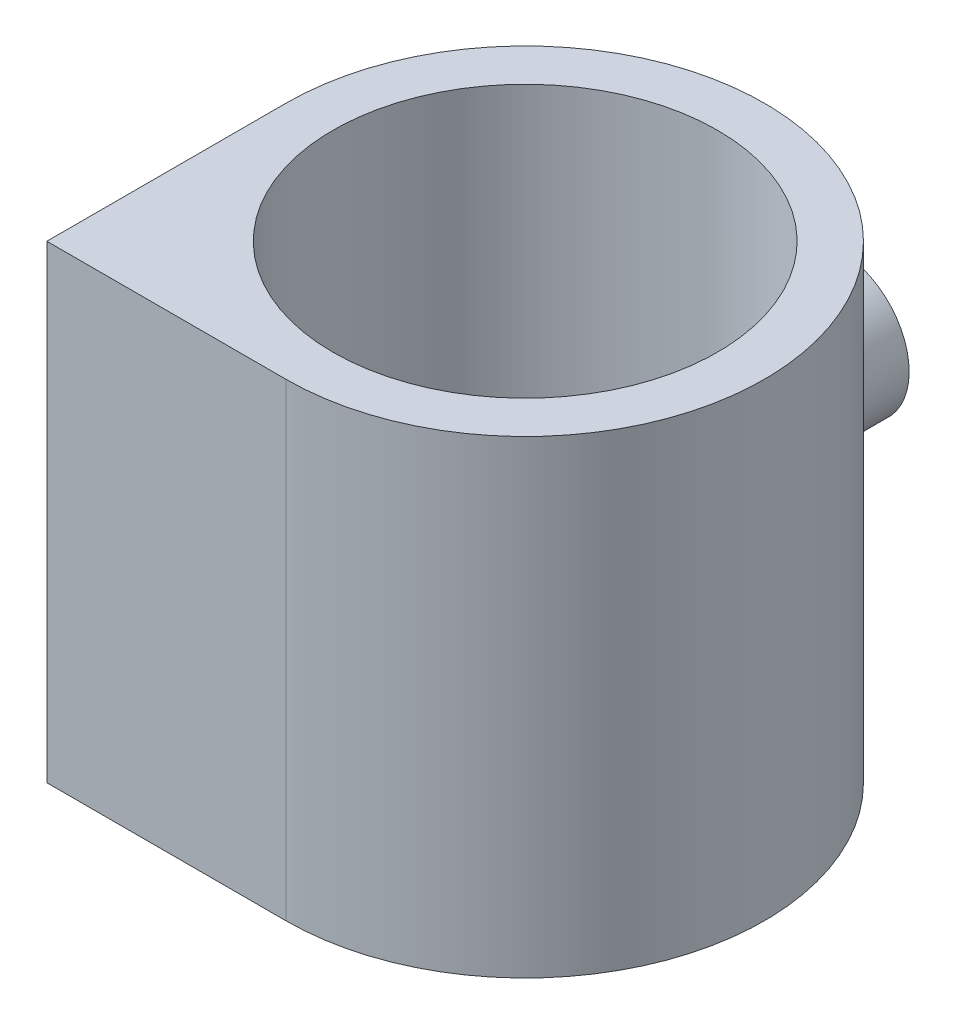
ISO-10303-21;
HEADER;
FILE_DESCRIPTION(('STEP AP214'),'2;1');
FILE_NAME('part.step','',(''),(''),'','','');
FILE_SCHEMA(('AUTOMOTIVE_DESIGN { 1 0 10303 214 1 1 1 1 }'));
ENDSEC;
DATA;
#1=APPLICATION_CONTEXT('core data for automotive mechanical design processes');
#2=APPLICATION_PROTOCOL_DEFINITION('international standard','automotive_design',2000,#1);
#3=PRODUCT_CONTEXT('',#1,'mechanical');
#4=PRODUCT('Part','Part','',(#3));
#5=PRODUCT_RELATED_PRODUCT_CATEGORY('part','',(#4));
#6=PRODUCT_DEFINITION_FORMATION('','',#4);
#7=PRODUCT_DEFINITION_CONTEXT('part definition',#1,'design');
#8=PRODUCT_DEFINITION('design','',#6,#7);
#9=PRODUCT_DEFINITION_SHAPE('','',#8);
#10=(LENGTH_UNIT() NAMED_UNIT(*) SI_UNIT(.MILLI.,.METRE.));
#11=(NAMED_UNIT(*) PLANE_ANGLE_UNIT() SI_UNIT($,.RADIAN.));
#12=(NAMED_UNIT(*) SI_UNIT($,.STERADIAN.) SOLID_ANGLE_UNIT());
#13=UNCERTAINTY_MEASURE_WITH_UNIT(LENGTH_MEASURE(1.E-05),#10,'distance_accuracy_value','');
#14=(GEOMETRIC_REPRESENTATION_CONTEXT(3) GLOBAL_UNCERTAINTY_ASSIGNED_CONTEXT((#13)) GLOBAL_UNIT_ASSIGNED_CONTEXT((#10,
#11,#12)) REPRESENTATION_CONTEXT('',''));
#15=CARTESIAN_POINT('',(0.,0.,0.));
#16=DIRECTION('',(0.,0.,1.));
#17=DIRECTION('',(1.,0.,0.));
#18=AXIS2_PLACEMENT_3D('',#15,#16,#17);
#19=CARTESIAN_POINT('',(103.,25.,-48.));
#20=DIRECTION('',(0.,0.,-1.));
#21=DIRECTION('',(-1.,0.,0.));
#22=AXIS2_PLACEMENT_3D('',#19,#20,#21);
#23=CONICAL_SURFACE('',#22,2.,0.785398163397451);
#24=CARTESIAN_POINT('',(103.,25.,-52.));
#25=DIRECTION('',(0.,0.,1.));
#26=DIRECTION('',(1.,0.,0.));
#27=AXIS2_PLACEMENT_3D('',#24,#25,#26);
#28=CIRCLE('',#27,6.00000000000006);
#29=CARTESIAN_POINT('',(96.9999999999999,25.,-52.));
#30=VERTEX_POINT('',#29);
#31=EDGE_CURVE('E49',#30,#30,#28,.T.);
#32=CARTESIAN_POINT('',(103.,25.,-48.));
#33=DIRECTION('',(0.,0.,1.));
#34=DIRECTION('',(1.,0.,0.));
#35=AXIS2_PLACEMENT_3D('',#32,#33,#34);
#36=CIRCLE('',#35,2.);
#37=CARTESIAN_POINT('',(101.,25.,-48.));
#38=VERTEX_POINT('',#37);
#39=EDGE_CURVE('E199',#38,#38,#36,.F.);
#40=CARTESIAN_POINT('',(96.9999999999999,25.,-52.));
#41=CARTESIAN_POINT('',(97.0416666666666,25.,-51.9583333333333));
#42=CARTESIAN_POINT('',(97.0833333333333,25.,-51.9166666666667));
#43=CARTESIAN_POINT('',(97.1666666666666,25.,-51.8333333333333));
#44=CARTESIAN_POINT('',(97.2083333333333,25.,-51.7916666666667));
#45=CARTESIAN_POINT('',(97.2916666666666,25.,-51.7083333333333));
#46=CARTESIAN_POINT('',(97.3333333333333,25.,-51.6666666666667));
#47=CARTESIAN_POINT('',(97.4166666666666,25.,-51.5833333333333));
#48=CARTESIAN_POINT('',(97.4583333333333,25.,-51.5416666666667));
#49=CARTESIAN_POINT('',(97.5416666666666,25.,-51.4583333333333));
#50=CARTESIAN_POINT('',(97.5833333333333,25.,-51.4166666666667));
#51=CARTESIAN_POINT('',(97.6666666666666,25.,-51.3333333333333));
#52=CARTESIAN_POINT('',(97.7083333333333,25.,-51.2916666666667));
#53=CARTESIAN_POINT('',(97.7916666666666,25.,-51.2083333333333));
#54=CARTESIAN_POINT('',(97.8333333333333,25.,-51.1666666666667));
#55=CARTESIAN_POINT('',(97.9166666666666,25.,-51.0833333333333));
#56=CARTESIAN_POINT('',(97.9583333333333,25.,-51.0416666666667));
#57=CARTESIAN_POINT('',(98.0416666666666,25.,-50.9583333333333));
#58=CARTESIAN_POINT('',(98.0833333333333,25.,-50.9166666666667));
#59=CARTESIAN_POINT('',(98.1666666666666,25.,-50.8333333333333));
#60=CARTESIAN_POINT('',(98.2083333333333,25.,-50.7916666666667));
#61=CARTESIAN_POINT('',(98.2916666666666,25.,-50.7083333333333));
#62=CARTESIAN_POINT('',(98.3333333333333,25.,-50.6666666666667));
#63=CARTESIAN_POINT('',(98.4166666666666,25.,-50.5833333333333));
#64=CARTESIAN_POINT('',(98.4583333333333,25.,-50.5416666666667));
#65=CARTESIAN_POINT('',(98.5416666666666,25.,-50.4583333333333));
#66=CARTESIAN_POINT('',(98.5833333333333,25.,-50.4166666666667));
#67=CARTESIAN_POINT('',(98.6666666666666,25.,-50.3333333333333));
#68=CARTESIAN_POINT('',(98.7083333333333,25.,-50.2916666666667));
#69=CARTESIAN_POINT('',(98.7916666666666,25.,-50.2083333333333));
#70=CARTESIAN_POINT('',(98.8333333333333,25.,-50.1666666666667));
#71=CARTESIAN_POINT('',(98.9166666666666,25.,-50.0833333333333));
#72=CARTESIAN_POINT('',(98.9583333333333,25.,-50.0416666666667));
#73=CARTESIAN_POINT('',(99.0416666666666,25.,-49.9583333333333));
#74=CARTESIAN_POINT('',(99.0833333333333,25.,-49.9166666666667));
#75=CARTESIAN_POINT('',(99.1666666666666,25.,-49.8333333333333));
#76=CARTESIAN_POINT('',(99.2083333333333,25.,-49.7916666666667));
#77=CARTESIAN_POINT('',(99.2916666666666,25.,-49.7083333333333));
#78=CARTESIAN_POINT('',(99.3333333333333,25.,-49.6666666666667));
#79=CARTESIAN_POINT('',(99.4166666666666,25.,-49.5833333333333));
#80=CARTESIAN_POINT('',(99.4583333333333,25.,-49.5416666666666));
#81=CARTESIAN_POINT('',(99.5416666666667,25.,-49.4583333333333));
#82=CARTESIAN_POINT('',(99.5833333333333,25.,-49.4166666666667));
#83=CARTESIAN_POINT('',(99.6666666666667,25.,-49.3333333333333));
#84=CARTESIAN_POINT('',(99.7083333333333,25.,-49.2916666666666));
#85=CARTESIAN_POINT('',(99.7916666666667,25.,-49.2083333333333));
#86=CARTESIAN_POINT('',(99.8333333333333,25.,-49.1666666666666));
#87=CARTESIAN_POINT('',(99.9166666666667,25.,-49.0833333333333));
#88=CARTESIAN_POINT('',(99.9583333333333,25.,-49.0416666666666));
#89=CARTESIAN_POINT('',(100.041666666667,25.,-48.9583333333333));
#90=CARTESIAN_POINT('',(100.083333333333,25.,-48.9166666666666));
#91=CARTESIAN_POINT('',(100.166666666667,25.,-48.8333333333333));
#92=CARTESIAN_POINT('',(100.208333333333,25.,-48.7916666666666));
#93=CARTESIAN_POINT('',(100.291666666667,25.,-48.7083333333333));
#94=CARTESIAN_POINT('',(100.333333333333,25.,-48.6666666666666));
#95=CARTESIAN_POINT('',(100.416666666667,25.,-48.5833333333333));
#96=CARTESIAN_POINT('',(100.458333333333,25.,-48.5416666666666));
#97=CARTESIAN_POINT('',(100.541666666667,25.,-48.4583333333333));
#98=CARTESIAN_POINT('',(100.583333333333,25.,-48.4166666666666));
#99=CARTESIAN_POINT('',(100.666666666667,25.,-48.3333333333333));
#100=CARTESIAN_POINT('',(100.708333333333,25.,-48.2916666666666));
#101=CARTESIAN_POINT('',(100.791666666667,25.,-48.2083333333333));
#102=CARTESIAN_POINT('',(100.833333333333,25.,-48.1666666666666));
#103=CARTESIAN_POINT('',(100.916666666667,25.,-48.0833333333333));
#104=CARTESIAN_POINT('',(100.958333333333,25.,-48.0416666666666));
#105=CARTESIAN_POINT('',(101.,25.,-48.));
#106=B_SPLINE_CURVE_WITH_KNOTS('',3,(#40,#41,#42,#43,#44,#45,#46,#47,#48,#49,#50,#51,#52,#53,
#54,#55,#56,#57,#58,#59,#60,#61,#62,#63,#64,#65,#66,#67,#68,#69,#70,#71,#72,#73,#74,#75,#76,#77,
#78,#79,#80,#81,#82,#83,#84,#85,#86,#87,#88,#89,#90,#91,#92,#93,#94,#95,#96,#97,#98,#99,#100,
#101,#102,#103,#104,#105),.UNSPECIFIED.,.F.,.F.,(4,2,2,2,2,2,2,2,2,2,2,2,2,2,2,2,2,2,2,2,2,2,2,
2,2,2,2,2,2,2,2,2,4),(0.,0.176776695296637,0.353553390593274,0.530330085889911,
0.707106781186548,0.883883476483195,1.06066017177984,1.23743686707647,1.41421356237311,
1.59099025766975,1.76776695296639,1.94454364826303,2.12132034355966,2.2980970388563,
2.47487373415295,2.65165042944959,2.82842712474622,3.00520382004286,3.1819805153395,
3.35875721063614,3.53553390593278,3.71231060122942,3.88908729652606,4.0658639918227,
4.24264068711934,4.41941738241598,4.59619407771261,4.77297077300926,4.9497474683059,
5.12652416360254,5.30330085889918,5.48007755419581,5.65685424949246),.UNSPECIFIED.);
#107=EDGE_CURVE('BSEAM41',#30,#38,#106,.T.);
#108=ORIENTED_EDGE('',*,*,#31,.F.);
#109=ORIENTED_EDGE('',*,*,#39,.F.);
#110=ORIENTED_EDGE('',*,*,#107,.T.);
#111=ORIENTED_EDGE('',*,*,#107,.F.);
#112=EDGE_LOOP('',(#108,#110,#109,#111));
#113=FACE_BOUND('',#112,.T.);
#114=ADVANCED_FACE('F41',(#113),#23,.F.);
#115=CARTESIAN_POINT('',(103.,25.,-52.));
#116=DIRECTION('',(0.,0.,1.));
#117=DIRECTION('',(1.,0.,0.));
#118=AXIS2_PLACEMENT_3D('',#115,#116,#117);
#119=PLANE('',#118);
#120=ORIENTED_EDGE('',*,*,#31,.T.);
#121=EDGE_LOOP('',(#120));
#122=FACE_BOUND('',#121,.T.);
#123=CARTESIAN_POINT('',(103.,25.,-52.));
#124=DIRECTION('',(0.,0.,1.));
#125=DIRECTION('',(1.,0.,0.));
#126=AXIS2_PLACEMENT_3D('',#123,#124,#125);
#127=CIRCLE('',#126,7.50000000000001);
#128=CARTESIAN_POINT('',(110.5,25.,-52.));
#129=VERTEX_POINT('',#128);
#130=EDGE_CURVE('E146',#129,#129,#127,.T.);
#131=ORIENTED_EDGE('',*,*,#130,.F.);
#132=EDGE_LOOP('',(#131));
#133=FACE_BOUND('',#132,.T.);
#134=ADVANCED_FACE('F206',(#122,#133),#119,.F.);
#135=CARTESIAN_POINT('',(103.,25.,6.93351096398718));
#136=DIRECTION('',(0.,0.,-1.));
#137=DIRECTION('',(-1.,0.,0.));
#138=AXIS2_PLACEMENT_3D('',#135,#136,#137);
#139=CYLINDRICAL_SURFACE('',#138,2.);
#140=ORIENTED_EDGE('',*,*,#39,.T.);
#141=EDGE_LOOP('',(#140));
#142=FACE_BOUND('',#141,.T.);
#143=CARTESIAN_POINT('',(101.,25.,-38.969694799116));
#144=CARTESIAN_POINT('',(101.00000486068,24.8879463126101,-38.9696960830209));
#145=CARTESIAN_POINT('',(101.009448731837,24.7758181889857,-38.9706278838935));
#146=CARTESIAN_POINT('',(101.04698009202,24.554669732685,-38.9742539673729));
#147=CARTESIAN_POINT('',(101.075088218365,24.4456529796158,-38.9769502008886));
#148=CARTESIAN_POINT('',(101.149122700976,24.2339619141491,-38.9837969003662));
#149=CARTESIAN_POINT('',(101.19503836553,24.1312838387844,-38.9879464935808));
#150=CARTESIAN_POINT('',(101.303364245341,23.935114412159,-38.9972312809159));
#151=CARTESIAN_POINT('',(101.365771145231,23.8416212195625,-39.002366276876));
#152=CARTESIAN_POINT('',(101.505540672371,23.6661287183812,-39.0130632385346));
#153=CARTESIAN_POINT('',(101.582948807655,23.5841657280325,-39.0186264715752));
#154=CARTESIAN_POINT('',(101.750426356388,23.4343728879621,-39.0295415517807));
#155=CARTESIAN_POINT('',(101.840496344652,23.3665436802241,-39.0348933893348));
#156=CARTESIAN_POINT('',(102.030962508133,23.2468189562056,-39.0447951171912));
#157=CARTESIAN_POINT('',(102.131378915973,23.1949554819303,-39.0493433871046));
#158=CARTESIAN_POINT('',(102.339546893281,23.1088394210507,-39.0571117405789));
#159=CARTESIAN_POINT('',(102.44729829185,23.0745864242963,-39.0603318550723));
#160=CARTESIAN_POINT('',(102.666711381263,23.0247698761163,-39.0650721881992));
#161=CARTESIAN_POINT('',(102.778359438483,23.009146799705,-39.0665978198452));
#162=CARTESIAN_POINT('',(103.002702670744,22.9968494196242,-39.0677956894787));
#163=CARTESIAN_POINT('',(103.115397819775,23.0001746465196,-39.067467973382));
#164=CARTESIAN_POINT('',(103.338232223104,23.0256311048035,-39.0650005083904));
#165=CARTESIAN_POINT('',(103.44837886745,23.0476983282686,-39.0628669269964));
#166=CARTESIAN_POINT('',(103.663397586473,23.1099126861504,-39.0570346306012));
#167=CARTESIAN_POINT('',(103.768269595454,23.1500600456885,-39.053335896112));
#168=CARTESIAN_POINT('',(103.969964175095,23.2473654033862,-39.0447785722716));
#169=CARTESIAN_POINT('',(104.066772969643,23.3045517798621,-39.0399180506676));
#170=CARTESIAN_POINT('',(104.249442746439,23.4342912541794,-39.0295826735495));
#171=CARTESIAN_POINT('',(104.33530342308,23.5068447808308,-39.0241078008943));
#172=CARTESIAN_POINT('',(104.494014493984,23.6656191295208,-39.0131313376707));
#173=CARTESIAN_POINT('',(104.566809205339,23.7518956226063,-39.0076297308037));
#174=CARTESIAN_POINT('',(104.696891018323,23.9354736567487,-38.9972426506239));
#175=CARTESIAN_POINT('',(104.754178099195,24.0327752125622,-38.9923571781357));
#176=CARTESIAN_POINT('',(104.851617920931,24.2356835486739,-38.9837549999125));
#177=CARTESIAN_POINT('',(104.891767308573,24.3412919495361,-38.9800385229447));
#178=CARTESIAN_POINT('',(104.953748432228,24.5577953893963,-38.9741998156193));
#179=CARTESIAN_POINT('',(104.975580698868,24.6686902751524,-38.9720775390797));
#180=CARTESIAN_POINT('',(105.000236394172,24.8921301994678,-38.9696754412969));
#181=CARTESIAN_POINT('',(105.003137683818,25.0046665685735,-38.9693880733851));
#182=CARTESIAN_POINT('',(104.990053465342,25.2286239076105,-38.9706684138276));
#183=CARTESIAN_POINT('',(104.974068199906,25.3400448918557,-38.9722360983447));
#184=CARTESIAN_POINT('',(104.923729740185,25.5583822147988,-38.9770430365472));
#185=CARTESIAN_POINT('',(104.889413286026,25.665307103962,-38.9802789462554));
#186=CARTESIAN_POINT('',(104.80342405039,25.871882671832,-38.9880550057656));
#187=CARTESIAN_POINT('',(104.751750889941,25.9715331916498,-38.9925951840453));
#188=CARTESIAN_POINT('',(104.632319693495,26.1610864223773,-39.0024864883886));
#189=CARTESIAN_POINT('',(104.564510016681,26.250956459243,-39.0078401976494));
#190=CARTESIAN_POINT('',(104.414804761259,26.4180664807062,-39.0187468359001));
#191=CARTESIAN_POINT('',(104.332908850744,26.4953061676163,-39.0242997695817));
#192=CARTESIAN_POINT('',(104.157018280982,26.635231010319,-39.0350019116049));
#193=CARTESIAN_POINT('',(104.062983139984,26.6978654052467,-39.040149671886));
#194=CARTESIAN_POINT('',(103.865683651097,26.8064525610623,-39.0494404043272));
#195=CARTESIAN_POINT('',(103.762419424376,26.8524055409204,-39.0535833896762));
#196=CARTESIAN_POINT('',(103.549770988104,26.9262392372338,-39.0603912096784));
#197=CARTESIAN_POINT('',(103.440397547418,26.9541507276984,-39.0630585602478));
#198=CARTESIAN_POINT('',(103.218489316174,26.9912095981814,-39.0666248784702));
#199=CARTESIAN_POINT('',(103.105954609964,27.0003574783583,-39.0675238932595));
#200=CARTESIAN_POINT('',(102.881417162161,26.9996226143531,-39.0674522365196));
#201=CARTESIAN_POINT('',(102.769414151675,26.9898187194281,-39.0664893116247));
#202=CARTESIAN_POINT('',(102.548654129323,26.9516237995767,-39.0628172599771));
#203=CARTESIAN_POINT('',(102.439897120334,26.9232327581739,-39.0601081316764));
#204=CARTESIAN_POINT('',(102.228716041813,26.8486910332154,-39.0532472762779));
#205=CARTESIAN_POINT('',(102.126291199769,26.8025425210159,-39.0490957255633));
#206=CARTESIAN_POINT('',(101.930629094193,26.6938043233318,-39.0398130645471));
#207=CARTESIAN_POINT('',(101.837391762613,26.6312147596335,-39.0346819615016));
#208=CARTESIAN_POINT('',(101.662347292486,26.49107533097,-39.0239896808848));
#209=CARTESIAN_POINT('',(101.580587227951,26.4134667907983,-39.0184268695411));
#210=CARTESIAN_POINT('',(101.431214872223,26.2456069786476,-39.0075119801462));
#211=CARTESIAN_POINT('',(101.363605985536,26.1553526730353,-39.0021599530565));
#212=CARTESIAN_POINT('',(101.244326612567,25.9645244081393,-38.9922586293314));
#213=CARTESIAN_POINT('',(101.192695345825,25.863925850373,-38.9877113195195));
#214=CARTESIAN_POINT('',(101.107125984209,25.6555075497295,-38.9799580411686));
#215=CARTESIAN_POINT('',(101.073167871717,25.5476961335,-38.9767505558848));
#216=CARTESIAN_POINT('',(101.032405437446,25.3660584612102,-38.972851505412));
#217=CARTESIAN_POINT('',(101.020269934122,25.2933945943964,-38.9716733138807));
#218=CARTESIAN_POINT('',(101.004065635032,25.1471645200266,-38.9700945406238));
#219=CARTESIAN_POINT('',(100.999996807442,25.0735983160314,-38.9696939558306));
#220=CARTESIAN_POINT('',(101.,25.,-38.969694799116));
#221=B_SPLINE_CURVE_WITH_KNOTS('',3,(#143,#144,#145,#146,#147,#148,#149,#150,#151,#152,#153,
#154,#155,#156,#157,#158,#159,#160,#161,#162,#163,#164,#165,#166,#167,#168,#169,#170,#171,#172,
#173,#174,#175,#176,#177,#178,#179,#180,#181,#182,#183,#184,#185,#186,#187,#188,#189,#190,#191,
#192,#193,#194,#195,#196,#197,#198,#199,#200,#201,#202,#203,#204,#205,#206,#207,#208,#209,#210,
#211,#212,#213,#214,#215,#216,#217,#218,#219,#220),.UNSPECIFIED.,.T.,.F.,(4,2,2,2,2,2,2,2,2,2,2,
2,2,2,2,2,2,2,2,2,2,2,2,2,2,2,2,2,2,2,2,2,2,2,2,2,2,2,4),(0.,0.335892301541997,
0.672156623548028,1.00821936296056,1.3442145922482,1.68124552639673,2.01829176580891,
2.35601008651017,2.69372054135775,3.03034905179675,3.36696922246428,3.7024443648623,
4.03792368448423,4.37396489489533,4.71001548354643,5.04746586089092,5.38491668990609,
5.72243351552498,6.05994056333077,6.39605860283304,6.73217232334475,7.06761490457077,
7.40306481044742,7.73960302799373,8.07614917633362,8.41384811852923,8.75154262772707,
9.08865958864432,9.42576756333367,9.76147601144196,10.0971847571353,10.4328524659161,
10.7685176883216,11.1055217515753,11.4426067986747,11.7805128274546,12.1180352871242,
12.3386545801012,12.5592730027274),.UNSPECIFIED.);
#222=CARTESIAN_POINT('',(101.,25.,-38.969694799116));
#223=VERTEX_POINT('',#222);
#224=EDGE_CURVE('E135',#223,#223,#221,.T.);
#225=ORIENTED_EDGE('',*,*,#224,.T.);
#226=EDGE_LOOP('',(#225));
#227=FACE_BOUND('',#226,.T.);
#228=ADVANCED_FACE('F148',(#142,#227),#139,.F.);
#229=CARTESIAN_POINT('',(103.,25.,-52.));
#230=DIRECTION('',(0.,0.,1.));
#231=DIRECTION('',(1.,0.,0.));
#232=AXIS2_PLACEMENT_3D('',#229,#230,#231);
#233=CYLINDRICAL_SURFACE('',#232,7.50000000000001);
#234=CARTESIAN_POINT('',(103.,32.5,-44.0674890360128));
#235=CARTESIAN_POINT('',(103.205915668017,32.4999995296236,-44.0674887380694));
#236=CARTESIAN_POINT('',(103.411839753064,32.4915127366717,-44.0649888700372));
#237=CARTESIAN_POINT('',(103.822178844363,32.4576410220455,-44.0550575858018));
#238=CARTESIAN_POINT('',(104.02659376787,32.432255180664,-44.0476259011914));
#239=CARTESIAN_POINT('',(104.432443147541,32.3648099827454,-44.0280347092028));
#240=CARTESIAN_POINT('',(104.633877308638,32.3227489868238,-44.0158747369746));
#241=CARTESIAN_POINT('',(105.032387871591,32.2223017052596,-43.9871532253036));
#242=CARTESIAN_POINT('',(105.229462632893,32.163909382826,-43.9705900583546));
#243=CARTESIAN_POINT('',(105.617465027791,32.031417044921,-43.9335449139472));
#244=CARTESIAN_POINT('',(105.80840334399,31.9573462441693,-43.9130702318881));
#245=CARTESIAN_POINT('',(106.183326453736,31.7939872925513,-43.8687159729348));
#246=CARTESIAN_POINT('',(106.367308602527,31.7046934235138,-43.8448351171478));
#247=CARTESIAN_POINT('',(106.727017906385,31.5116045221839,-43.7943064604351));
#248=CARTESIAN_POINT('',(106.902747752721,31.4078142620073,-43.7676595708076));
#249=CARTESIAN_POINT('',(107.245017959279,31.186387336861,-43.712267740582));
#250=CARTESIAN_POINT('',(107.411554057356,31.0687443277454,-43.6835218410073));
#251=CARTESIAN_POINT('',(107.738346725457,30.817354316015,-43.6239520056865));
#252=CARTESIAN_POINT('',(107.898346230261,30.6832810631069,-43.5930942637775));
#253=CARTESIAN_POINT('',(108.206559935755,30.4023344532312,-43.5307912916036));
#254=CARTESIAN_POINT('',(108.354773939753,30.2554608827199,-43.4993460515446));
#255=CARTESIAN_POINT('',(108.63852966267,29.9497963854527,-43.4367090763184));
#256=CARTESIAN_POINT('',(108.774067026199,29.7910013963167,-43.4055174316167));
#257=CARTESIAN_POINT('',(109.03148209145,29.4625930424128,-43.3442669993079));
#258=CARTESIAN_POINT('',(109.153364859209,29.292983726797,-43.3142077943162));
#259=CARTESIAN_POINT('',(109.385215684508,28.9401213240984,-43.2554140504515));
#260=CARTESIAN_POINT('',(109.494863957097,28.7566506419938,-43.2267229991831));
#261=CARTESIAN_POINT('',(109.69822233168,28.3807490374233,-43.1722629708791));
#262=CARTESIAN_POINT('',(109.791938259896,28.1883214233068,-43.1464929268282));
#263=CARTESIAN_POINT('',(109.962724192924,27.7957625340694,-43.0986598629597));
#264=CARTESIAN_POINT('',(110.039793978981,27.5956311577505,-43.0765968918593));
#265=CARTESIAN_POINT('',(110.176614682252,27.189107578808,-43.0368838602041));
#266=CARTESIAN_POINT('',(110.236366190089,26.9827155899614,-43.0192336491595));
#267=CARTESIAN_POINT('',(110.336627738696,26.570857477845,-42.9893349386893));
#268=CARTESIAN_POINT('',(110.3776138143,26.3655168632353,-42.9769534394786));
#269=CARTESIAN_POINT('',(110.442292580671,25.9518899729857,-42.9573112509211));
#270=CARTESIAN_POINT('',(110.465985858512,25.7436037975895,-42.950050387734));
#271=CARTESIAN_POINT('',(110.495851802121,25.3257014994561,-42.9408854106707));
#272=CARTESIAN_POINT('',(110.502027840913,25.1160856405473,-42.9389802655275));
#273=CARTESIAN_POINT('',(110.496808743468,24.6970959579262,-42.9405862355656));
#274=CARTESIAN_POINT('',(110.485413968034,24.4877221293323,-42.9440972395305));
#275=CARTESIAN_POINT('',(110.445865913317,24.0780764073173,-42.9562054199177));
#276=CARTESIAN_POINT('',(110.418309239498,23.8777412051803,-42.9646214640173));
#277=CARTESIAN_POINT('',(110.34716184161,23.4801263686961,-42.9861415935933));
#278=CARTESIAN_POINT('',(110.303565761193,23.2828477780638,-42.9992472451207));
#279=CARTESIAN_POINT('',(110.200725916095,22.8928192157111,-43.0297542136444));
#280=CARTESIAN_POINT('',(110.141486744799,22.7000679326701,-43.0471542695484));
#281=CARTESIAN_POINT('',(110.007807488675,22.3202259814546,-43.0857571537641));
#282=CARTESIAN_POINT('',(109.9333616678,22.1331374799846,-43.1069614166793));
#283=CARTESIAN_POINT('',(109.768792551071,21.7635047153662,-43.1528675034471));
#284=CARTESIAN_POINT('',(109.678479530366,21.5810501204456,-43.1776108901996));
#285=CARTESIAN_POINT('',(109.483476450874,21.224305013117,-43.229701353751));
#286=CARTESIAN_POINT('',(109.378781459854,21.0500173291345,-43.2570493227889));
#287=CARTESIAN_POINT('',(109.155749765203,20.7107152903064,-43.3135993424565));
#288=CARTESIAN_POINT('',(109.0374127273,20.5457011628404,-43.3428014385104));
#289=CARTESIAN_POINT('',(108.787859851109,20.2259225744319,-43.4022857691537));
#290=CARTESIAN_POINT('',(108.656643662547,20.0711583924506,-43.4325680331062));
#291=CARTESIAN_POINT('',(108.376607280376,19.766782757273,-43.4946524585605));
#292=CARTESIAN_POINT('',(108.227290939091,19.6176298417742,-43.5264667152571));
#293=CARTESIAN_POINT('',(107.916610409116,19.3324260207335,-43.5895204046619));
#294=CARTESIAN_POINT('',(107.755250139454,19.1963708859586,-43.6207600202664));
#295=CARTESIAN_POINT('',(107.4213934988,18.9381661418748,-43.6818292321948));
#296=CARTESIAN_POINT('',(107.248892296858,18.8160226292562,-43.71165820699));
#297=CARTESIAN_POINT('',(106.893997941783,18.5866229433666,-43.7690579028449));
#298=CARTESIAN_POINT('',(106.711608700967,18.4793609409843,-43.7966295063759));
#299=CARTESIAN_POINT('',(106.336831857498,18.2798125119395,-43.8489364377003));
#300=CARTESIAN_POINT('',(106.144385746765,18.1876305997302,-43.8736516491442));
#301=CARTESIAN_POINT('',(105.752029296844,18.0198971910743,-43.9193197669178));
#302=CARTESIAN_POINT('',(105.552121822374,17.9443393872419,-43.9402740996119));
#303=CARTESIAN_POINT('',(105.146217406043,17.8104646331538,-43.977827237366));
#304=CARTESIAN_POINT('',(104.940220605217,17.7521472839355,-43.9944261432143));
#305=CARTESIAN_POINT('',(104.52367977828,17.6532854345892,-44.0227825612621));
#306=CARTESIAN_POINT('',(104.31313591149,17.612740312816,-44.0345402427995));
#307=CARTESIAN_POINT('',(103.896473294796,17.5508961838528,-44.0525494710011));
#308=CARTESIAN_POINT('',(103.690453670192,17.5289795090739,-44.0589775371711));
#309=CARTESIAN_POINT('',(103.277213907848,17.5022657177814,-44.066819507084));
#310=CARTESIAN_POINT('',(103.069993797976,17.4974682054664,-44.0682335267536));
#311=CARTESIAN_POINT('',(102.655919679773,17.5050361176334,-44.0660080358234));
#312=CARTESIAN_POINT('',(102.449065631819,17.517399554331,-44.0623691105155));
#313=CARTESIAN_POINT('',(102.037235511325,17.5591720268785,-44.0501404412785));
#314=CARTESIAN_POINT('',(101.832259426356,17.5885809498444,-44.041550730136));
#315=CARTESIAN_POINT('',(101.430116914293,17.6633535212265,-44.0198982194108));
#316=CARTESIAN_POINT('',(101.232877629604,17.7083556854088,-44.0069369295326));
#317=CARTESIAN_POINT('',(100.842907862811,17.8140567909992,-43.97684191994));
#318=CARTESIAN_POINT('',(100.650178918099,17.8747610020074,-43.9597067996026));
#319=CARTESIAN_POINT('',(100.270621628881,18.0113545957515,-43.921716792661));
#320=CARTESIAN_POINT('',(100.08379170201,18.0872398655264,-43.9008629137353));
#321=CARTESIAN_POINT('',(99.7170940821139,18.2536612276713,-43.8559581013117));
#322=CARTESIAN_POINT('',(99.5372290426115,18.3442028371471,-43.8319059645004));
#323=CARTESIAN_POINT('',(99.1817341080606,18.5414339588736,-43.7806564197348));
#324=CARTESIAN_POINT('',(99.00628646784,18.6484369248016,-43.7534011103808));
#325=CARTESIAN_POINT('',(98.6649187307005,18.876340545651,-43.6968944819025));
#326=CARTESIAN_POINT('',(98.4990019579364,18.9972460058486,-43.6676424740652));
#327=CARTESIAN_POINT('',(98.1777585701772,19.2521282342012,-43.607910043836));
#328=CARTESIAN_POINT('',(98.0224324068177,19.3861055592132,-43.5774295691444));
#329=CARTESIAN_POINT('',(97.7233133996678,19.6662795893743,-43.5160339777017));
#330=CARTESIAN_POINT('',(97.579520765753,19.8124765167845,-43.4851188530534));
#331=CARTESIAN_POINT('',(97.2995238552007,20.1215211569224,-43.422586451124));
#332=CARTESIAN_POINT('',(97.1637620329754,20.2847728158077,-43.3909825288457));
#333=CARTESIAN_POINT('',(96.9065013746015,20.622296697261,-43.329087908088));
#334=CARTESIAN_POINT('',(96.7849977177873,20.7965651642207,-43.2987967679561));
#335=CARTESIAN_POINT('',(96.5570193404107,21.1551140264299,-43.2403862657869));
#336=CARTESIAN_POINT('',(96.450550273753,21.3393981522781,-43.2122677225665));
#337=CARTESIAN_POINT('',(96.2535431498467,21.7166211218886,-43.1590675290183));
#338=CARTESIAN_POINT('',(96.1629985656659,21.9095563789485,-43.1339846357963));
#339=CARTESIAN_POINT('',(95.998900042944,22.3019247383659,-43.0877222942502));
#340=CARTESIAN_POINT('',(95.9252699476037,22.5013239112538,-43.0665254399833));
#341=CARTESIAN_POINT('',(95.7951296494944,22.9059631277247,-43.0285691794658));
#342=CARTESIAN_POINT('',(95.7386127395468,23.1112008484115,-43.0118080350508));
#343=CARTESIAN_POINT('',(95.643181021036,23.526055280542,-42.9832564710079));
#344=CARTESIAN_POINT('',(95.6042648583236,23.7356716538066,-42.9714656689814));
#345=CARTESIAN_POINT('',(95.5444036305868,24.1576835379658,-42.953244441164));
#346=CARTESIAN_POINT('',(95.5234579150934,24.3700789479863,-42.9468138213531));
#347=CARTESIAN_POINT('',(95.5002177799405,24.7874348259803,-42.9396740830179));
#348=CARTESIAN_POINT('',(95.4972095227697,24.9923521264756,-42.9387459950373));
#349=CARTESIAN_POINT('',(95.5079673544192,25.4017030925894,-42.9420552778804));
#350=CARTESIAN_POINT('',(95.5217332106253,25.6061367648752,-42.9462925770734));
#351=CARTESIAN_POINT('',(95.5659113651201,26.0130160076066,-42.959800467864));
#352=CARTESIAN_POINT('',(95.596322831949,26.2154616768402,-42.9690708080574));
#353=CARTESIAN_POINT('',(95.673518527321,26.6169271416201,-42.9923593818648));
#354=CARTESIAN_POINT('',(95.7203028341644,26.815946920778,-43.0063776381849));
#355=CARTESIAN_POINT('',(95.8291992159839,27.2068772898818,-43.0385494174267));
#356=CARTESIAN_POINT('',(95.8911257750884,27.398843780141,-43.0566526994632));
#357=CARTESIAN_POINT('',(96.03010460634,27.7768924991283,-43.0965693846593));
#358=CARTESIAN_POINT('',(96.1071619531362,27.9629727293112,-43.1183840322288));
#359=CARTESIAN_POINT('',(96.2757937578397,28.3279814775326,-43.165104749293));
#360=CARTESIAN_POINT('',(96.3673653665054,28.5069113906096,-43.1900102118333));
#361=CARTESIAN_POINT('',(96.5644266205696,28.8566434124557,-43.2422491171976));
#362=CARTESIAN_POINT('',(96.6699212369907,29.0274425884779,-43.2695834260642));
#363=CARTESIAN_POINT('',(96.898035860212,29.3656711610408,-43.3269385493401));
#364=CARTESIAN_POINT('',(97.0211260756995,29.5327733061701,-43.3570199109565));
#365=CARTESIAN_POINT('',(97.2806254637082,29.8561021831727,-43.4181735409251));
#366=CARTESIAN_POINT('',(97.417034972152,30.0123286405829,-43.449245834256));
#367=CARTESIAN_POINT('',(97.7023598683196,30.3130009603973,-43.5115531679054));
#368=CARTESIAN_POINT('',(97.8512803574085,30.4574419694892,-43.5427882696923));
#369=CARTESIAN_POINT('',(98.1605992701152,30.7335120304703,-43.604562785744));
#370=CARTESIAN_POINT('',(98.3209938264179,30.8651453641897,-43.6351024298789));
#371=CARTESIAN_POINT('',(98.6569862581723,31.1183095040436,-43.6955246434295));
#372=CARTESIAN_POINT('',(98.8328850098057,31.2394516062914,-43.7253645147346));
#373=CARTESIAN_POINT('',(99.194594561361,31.4664099551577,-43.7826114631335));
#374=CARTESIAN_POINT('',(99.3804017253542,31.5722317713746,-43.8100194229243));
#375=CARTESIAN_POINT('',(99.7606859823474,31.7677578153092,-43.8616316925016));
#376=CARTESIAN_POINT('',(99.9551610621463,31.8574657615206,-43.8858367410629));
#377=CARTESIAN_POINT('',(100.351446534795,32.020044207738,-43.9303536581019));
#378=CARTESIAN_POINT('',(100.553256164931,32.0929164527079,-43.9506659300156));
#379=CARTESIAN_POINT('',(100.938654794054,32.2136473204241,-43.9846833299054));
#380=CARTESIAN_POINT('',(101.121597054764,32.2634393368332,-43.9988844505899));
#381=CARTESIAN_POINT('',(101.490967716856,32.3490649856391,-44.0234720425632));
#382=CARTESIAN_POINT('',(101.677395902449,32.3848994790658,-44.0338587491584));
#383=CARTESIAN_POINT('',(102.052624178142,32.4423454155783,-44.0505765443744));
#384=CARTESIAN_POINT('',(102.241424416658,32.4639559641278,-44.0569073779228));
#385=CARTESIAN_POINT('',(102.620147650583,32.4927810411338,-44.0653630505681));
#386=CARTESIAN_POINT('',(102.810070244855,32.5000004338596,-44.0674893108259));
#387=CARTESIAN_POINT('',(103.,32.5,-44.0674890360128));
#388=B_SPLINE_CURVE_WITH_KNOTS('',3,(#234,#235,#236,#237,#238,#239,#240,#241,#242,#243,#244,
#245,#246,#247,#248,#249,#250,#251,#252,#253,#254,#255,#256,#257,#258,#259,#260,#261,#262,#263,
#264,#265,#266,#267,#268,#269,#270,#271,#272,#273,#274,#275,#276,#277,#278,#279,#280,#281,#282,
#283,#284,#285,#286,#287,#288,#289,#290,#291,#292,#293,#294,#295,#296,#297,#298,#299,#300,#301,
#302,#303,#304,#305,#306,#307,#308,#309,#310,#311,#312,#313,#314,#315,#316,#317,#318,#319,#320,
#321,#322,#323,#324,#325,#326,#327,#328,#329,#330,#331,#332,#333,#334,#335,#336,#337,#338,#339,
#340,#341,#342,#343,#344,#345,#346,#347,#348,#349,#350,#351,#352,#353,#354,#355,#356,#357,#358,
#359,#360,#361,#362,#363,#364,#365,#366,#367,#368,#369,#370,#371,#372,#373,#374,#375,#376,#377,
#378,#379,#380,#381,#382,#383,#384,#385,#386,#387),.UNSPECIFIED.,.T.,.F.,(4,2,2,2,2,2,2,2,2,2,2,
2,2,2,2,2,2,2,2,2,2,2,2,2,2,2,2,2,2,2,2,2,2,2,2,2,2,2,2,2,2,2,2,2,2,2,2,2,2,2,2,2,2,2,2,2,2,2,2,
2,2,2,2,2,2,2,2,2,2,2,2,2,2,2,2,2,4),(0.,0.61757237040623,1.23517835407715,1.85284507150706,
2.47074040871656,3.08749436088958,3.70448049401372,4.32126399601831,4.93833107318431,
5.57065496826598,6.20298941423114,6.8355403231617,7.46785576458129,8.11403344701502,
8.75997432116778,9.40592368341785,10.0518510136266,10.6803353183719,11.3087982857028,
11.937140231438,12.5654692748372,13.171946429269,13.7786263004416,14.385128225885,
14.9918593517194,15.606411750101,16.2211754351543,16.8359541871149,17.4507496639471,
18.0903050633753,18.7296532547569,19.3692805674666,20.008656625476,20.6522916860424,
21.2956821210191,21.9390576660882,22.5824107050707,23.2034923399808,23.8245596151577,
24.445554956971,25.0665461862817,25.674010798069,26.2816795398143,26.8891838700146,
27.4969174179678,28.1181222488949,28.7395424429575,29.3609891208755,29.9824471046899,
30.6256813121225,31.2686974125343,31.911954685118,32.5549476897113,33.1949862790024,
33.8347736920111,34.4745118733052,35.1142268972857,35.7283043704725,36.3423733280706,
36.9564116152954,37.5704528390939,38.1773181308538,38.7843873052441,39.3913374553669,
39.998504898098,40.6269263760446,41.2553637073415,41.8840585399934,42.5125424615158,
43.158718511171,43.8046590542923,44.4504503458546,45.0961746732586,45.6659948242067,
46.2357798177755,46.8056006413941,47.3752288305705),.UNSPECIFIED.);
#389=CARTESIAN_POINT('',(103.,32.5,-44.0674890360128));
#390=VERTEX_POINT('',#389);
#391=EDGE_CURVE('E191',#390,#390,#388,.T.);
#392=ORIENTED_EDGE('',*,*,#391,.T.);
#393=EDGE_LOOP('',(#392));
#394=FACE_BOUND('',#393,.T.);
#395=ORIENTED_EDGE('',*,*,#130,.T.);
#396=EDGE_LOOP('',(#395));
#397=FACE_BOUND('',#396,.T.);
#398=ADVANCED_FACE('F202',(#394,#397),#233,.T.);
#399=CARTESIAN_POINT('',(0.,50.,6.93251096398718));
#400=DIRECTION('',(0.,0.,-1.));
#401=DIRECTION('',(-1.,0.,0.));
#402=AXIS2_PLACEMENT_3D('',#399,#400,#401);
#403=PLANE('',#402);
#404=DIRECTION('',(0.,1.,0.));
#405=VECTOR('',#404,1.);
#406=CARTESIAN_POINT('',(77.5,50.,6.93251096398718));
#407=LINE('',#406,#405);
#408=CARTESIAN_POINT('',(77.5,0.,6.93251096398718));
#409=VERTEX_POINT('',#408);
#410=CARTESIAN_POINT('',(77.5,50.,6.93251096398718));
#411=VERTEX_POINT('',#410);
#412=EDGE_CURVE('E11',#409,#411,#407,.T.);
#413=ORIENTED_EDGE('',*,*,#412,.F.);
#414=DIRECTION('',(1.,0.,0.));
#415=VECTOR('',#414,1.);
#416=CARTESIAN_POINT('',(0.,0.,6.93251096398718));
#417=LINE('',#416,#415);
#418=CARTESIAN_POINT('',(103.,0.,6.93251096398718));
#419=VERTEX_POINT('',#418);
#420=EDGE_CURVE('E220',#409,#419,#417,.T.);
#421=ORIENTED_EDGE('',*,*,#420,.T.);
#422=DIRECTION('',(0.,-1.,0.));
#423=VECTOR('',#422,1.);
#424=CARTESIAN_POINT('',(103.,50.,6.93251096398718));
#425=LINE('',#424,#423);
#426=CARTESIAN_POINT('',(103.,50.,6.93251096398718));
#427=VERTEX_POINT('',#426);
#428=EDGE_CURVE('E200',#427,#419,#425,.T.);
#429=ORIENTED_EDGE('',*,*,#428,.F.);
#430=DIRECTION('',(1.,0.,0.));
#431=VECTOR('',#430,1.);
#432=CARTESIAN_POINT('',(0.,50.,6.93251096398718));
#433=LINE('',#432,#431);
#434=EDGE_CURVE('E229',#411,#427,#433,.T.);
#435=ORIENTED_EDGE('',*,*,#434,.F.);
#436=EDGE_LOOP('',(#413,#421,#429,#435));
#437=FACE_BOUND('',#436,.T.);
#438=ADVANCED_FACE('F188',(#437),#403,.F.);
#439=CARTESIAN_POINT('',(103.,50.,-18.5674890360128));
#440=DIRECTION('',(0.,-1.,0.));
#441=DIRECTION('',(0.,0.,-1.));
#442=AXIS2_PLACEMENT_3D('',#439,#440,#441);
#443=CYLINDRICAL_SURFACE('',#442,25.5);
#444=ORIENTED_EDGE('',*,*,#391,.F.);
#445=EDGE_LOOP('',(#444));
#446=FACE_BOUND('',#445,.T.);
#447=CARTESIAN_POINT('',(103.,0.,-18.5674890360128));
#448=DIRECTION('',(0.,1.,0.));
#449=DIRECTION('',(0.,0.,1.));
#450=AXIS2_PLACEMENT_3D('',#447,#448,#449);
#451=CIRCLE('',#450,25.5);
#452=CARTESIAN_POINT('',(77.5,0.,-18.5674890360128));
#453=VERTEX_POINT('',#452);
#454=EDGE_CURVE('E223',#453,#419,#451,.F.);
#455=ORIENTED_EDGE('',*,*,#454,.F.);
#456=DIRECTION('',(0.,-1.,0.));
#457=VECTOR('',#456,1.);
#458=CARTESIAN_POINT('',(77.5,50.,-18.5674890360128));
#459=LINE('',#458,#457);
#460=CARTESIAN_POINT('',(77.5,50.,-18.5674890360128));
#461=VERTEX_POINT('',#460);
#462=EDGE_CURVE('E233',#461,#453,#459,.T.);
#463=ORIENTED_EDGE('',*,*,#462,.F.);
#464=CARTESIAN_POINT('',(103.,50.,-18.5674890360128));
#465=DIRECTION('',(0.,1.,0.));
#466=DIRECTION('',(0.,0.,1.));
#467=AXIS2_PLACEMENT_3D('',#464,#465,#466);
#468=CIRCLE('',#467,25.5);
#469=EDGE_CURVE('E236',#461,#427,#468,.F.);
#470=ORIENTED_EDGE('',*,*,#469,.T.);
#471=ORIENTED_EDGE('',*,*,#428,.T.);
#472=EDGE_LOOP('',(#455,#463,#470,#471));
#473=FACE_BOUND('',#472,.T.);
#474=ADVANCED_FACE('F185',(#446,#473),#443,.T.);
#475=CARTESIAN_POINT('',(103.,50.,-18.5674890360128));
#476=DIRECTION('',(0.,-1.,0.));
#477=DIRECTION('',(0.,0.,-1.));
#478=AXIS2_PLACEMENT_3D('',#475,#476,#477);
#479=CYLINDRICAL_SURFACE('',#478,20.5);
#480=ORIENTED_EDGE('',*,*,#224,.F.);
#481=EDGE_LOOP('',(#480));
#482=FACE_BOUND('',#481,.T.);
#483=CARTESIAN_POINT('',(103.,50.,-18.5674890360128));
#484=DIRECTION('',(0.,1.,0.));
#485=DIRECTION('',(0.,0.,1.));
#486=AXIS2_PLACEMENT_3D('',#483,#484,#485);
#487=CIRCLE('',#486,20.5);
#488=CARTESIAN_POINT('',(103.,50.,1.93251096398716));
#489=VERTEX_POINT('',#488);
#490=EDGE_CURVE('E235',#489,#489,#487,.F.);
#491=ORIENTED_EDGE('',*,*,#490,.F.);
#492=EDGE_LOOP('',(#491));
#493=FACE_BOUND('',#492,.T.);
#494=CARTESIAN_POINT('',(103.,0.,-18.5674890360128));
#495=DIRECTION('',(0.,1.,0.));
#496=DIRECTION('',(0.,0.,1.));
#497=AXIS2_PLACEMENT_3D('',#494,#495,#496);
#498=CIRCLE('',#497,20.5);
#499=CARTESIAN_POINT('',(103.,0.,1.93251096398716));
#500=VERTEX_POINT('',#499);
#501=EDGE_CURVE('E218',#500,#500,#498,.F.);
#502=ORIENTED_EDGE('',*,*,#501,.T.);
#503=EDGE_LOOP('',(#502));
#504=FACE_BOUND('',#503,.T.);
#505=ADVANCED_FACE('F183',(#482,#493,#504),#479,.F.);
#506=CARTESIAN_POINT('',(0.,0.,0.));
#507=DIRECTION('',(0.,1.,0.));
#508=DIRECTION('',(0.,0.,1.));
#509=AXIS2_PLACEMENT_3D('',#506,#507,#508);
#510=PLANE('',#509);
#511=ORIENTED_EDGE('',*,*,#501,.F.);
#512=EDGE_LOOP('',(#511));
#513=FACE_BOUND('',#512,.T.);
#514=ORIENTED_EDGE('',*,*,#420,.F.);
#515=DIRECTION('',(0.,0.,1.));
#516=VECTOR('',#515,1.);
#517=CARTESIAN_POINT('',(77.5,0.,0.));
#518=LINE('',#517,#516);
#519=EDGE_CURVE('E63',#453,#409,#518,.T.);
#520=ORIENTED_EDGE('',*,*,#519,.F.);
#521=ORIENTED_EDGE('',*,*,#454,.T.);
#522=EDGE_LOOP('',(#514,#520,#521));
#523=FACE_BOUND('',#522,.T.);
#524=ADVANCED_FACE('F178',(#513,#523),#510,.F.);
#525=CARTESIAN_POINT('',(0.,50.,0.));
#526=DIRECTION('',(0.,1.,0.));
#527=DIRECTION('',(0.,0.,1.));
#528=AXIS2_PLACEMENT_3D('',#525,#526,#527);
#529=PLANE('',#528);
#530=ORIENTED_EDGE('',*,*,#490,.T.);
#531=EDGE_LOOP('',(#530));
#532=FACE_BOUND('',#531,.T.);
#533=DIRECTION('',(0.,0.,1.));
#534=VECTOR('',#533,1.);
#535=CARTESIAN_POINT('',(77.5,50.,0.));
#536=LINE('',#535,#534);
#537=EDGE_CURVE('E231',#461,#411,#536,.T.);
#538=ORIENTED_EDGE('',*,*,#537,.T.);
#539=ORIENTED_EDGE('',*,*,#434,.T.);
#540=ORIENTED_EDGE('',*,*,#469,.F.);
#541=EDGE_LOOP('',(#538,#539,#540));
#542=FACE_BOUND('',#541,.T.);
#543=ADVANCED_FACE('F170',(#532,#542),#529,.T.);
#544=CARTESIAN_POINT('',(77.5,50.,0.));
#545=DIRECTION('',(1.,0.,0.));
#546=DIRECTION('',(0.,0.,-1.));
#547=AXIS2_PLACEMENT_3D('',#544,#545,#546);
#548=PLANE('',#547);
#549=DIRECTION('',(0.,0.,-1.));
#550=VECTOR('',#549,1.);
#551=CARTESIAN_POINT('',(77.5,47.75,-4.25248903601282));
#552=LINE('',#551,#550);
#553=CARTESIAN_POINT('',(77.5,47.75,4.24751096398718));
#554=VERTEX_POINT('',#553);
#555=CARTESIAN_POINT('',(77.5,47.75,-4.25248903601282));
#556=VERTEX_POINT('',#555);
#557=EDGE_CURVE('E129',#554,#556,#552,.T.);
#558=ORIENTED_EDGE('',*,*,#557,.F.);
#559=DIRECTION('',(0.,1.,0.));
#560=VECTOR('',#559,1.);
#561=CARTESIAN_POINT('',(77.5,47.75,4.24751096398718));
#562=LINE('',#561,#560);
#563=CARTESIAN_POINT('',(77.5,2.25,4.24751096398719));
#564=VERTEX_POINT('',#563);
#565=EDGE_CURVE('E56',#564,#554,#562,.T.);
#566=ORIENTED_EDGE('',*,*,#565,.F.);
#567=DIRECTION('',(0.,0.,1.));
#568=VECTOR('',#567,1.);
#569=CARTESIAN_POINT('',(77.5,2.24999999999999,-4.25248903601281));
#570=LINE('',#569,#568);
#571=CARTESIAN_POINT('',(77.5,2.24999999999999,-4.25248903601281));
#572=VERTEX_POINT('',#571);
#573=EDGE_CURVE('E120',#572,#564,#570,.T.);
#574=ORIENTED_EDGE('',*,*,#573,.F.);
#575=DIRECTION('',(0.,-1.,0.));
#576=VECTOR('',#575,1.);
#577=CARTESIAN_POINT('',(77.5,47.75,-4.25248903601282));
#578=LINE('',#577,#576);
#579=EDGE_CURVE('E123',#556,#572,#578,.T.);
#580=ORIENTED_EDGE('',*,*,#579,.F.);
#581=EDGE_LOOP('',(#558,#566,#574,#580));
#582=FACE_BOUND('',#581,.T.);
#583=ORIENTED_EDGE('',*,*,#519,.T.);
#584=ORIENTED_EDGE('',*,*,#412,.T.);
#585=ORIENTED_EDGE('',*,*,#537,.F.);
#586=ORIENTED_EDGE('',*,*,#462,.T.);
#587=EDGE_LOOP('',(#583,#584,#585,#586));
#588=FACE_BOUND('',#587,.T.);
#589=ADVANCED_FACE('F156',(#582,#588),#548,.F.);
#590=CARTESIAN_POINT('',(83.5,47.75,4.24751096398718));
#591=DIRECTION('',(0.,0.,1.));
#592=DIRECTION('',(0.,-1.,0.));
#593=AXIS2_PLACEMENT_3D('',#590,#591,#592);
#594=PLANE('',#593);
#595=ORIENTED_EDGE('',*,*,#565,.T.);
#596=DIRECTION('',(-1.,0.,0.));
#597=VECTOR('',#596,1.);
#598=CARTESIAN_POINT('',(83.5,47.75,4.24751096398718));
#599=LINE('',#598,#597);
#600=CARTESIAN_POINT('',(83.5,47.75,4.24751096398718));
#601=VERTEX_POINT('',#600);
#602=EDGE_CURVE('E98',#601,#554,#599,.T.);
#603=ORIENTED_EDGE('',*,*,#602,.F.);
#604=DIRECTION('',(0.,1.,0.));
#605=VECTOR('',#604,1.);
#606=CARTESIAN_POINT('',(83.5,47.75,4.24751096398718));
#607=LINE('',#606,#605);
#608=CARTESIAN_POINT('',(83.5,2.25,4.24751096398719));
#609=VERTEX_POINT('',#608);
#610=EDGE_CURVE('E102',#609,#601,#607,.T.);
#611=ORIENTED_EDGE('',*,*,#610,.F.);
#612=DIRECTION('',(-1.,0.,0.));
#613=VECTOR('',#612,1.);
#614=CARTESIAN_POINT('',(83.5,2.25,4.24751096398719));
#615=LINE('',#614,#613);
#616=EDGE_CURVE('E133',#609,#564,#615,.T.);
#617=ORIENTED_EDGE('',*,*,#616,.T.);
#618=EDGE_LOOP('',(#595,#603,#611,#617));
#619=FACE_BOUND('',#618,.T.);
#620=ADVANCED_FACE('F100',(#619),#594,.F.);
#621=CARTESIAN_POINT('',(83.5,2.24999999999999,-4.25248903601281));
#622=DIRECTION('',(0.,-1.,0.));
#623=DIRECTION('',(0.,0.,-1.));
#624=AXIS2_PLACEMENT_3D('',#621,#622,#623);
#625=PLANE('',#624);
#626=ORIENTED_EDGE('',*,*,#573,.T.);
#627=ORIENTED_EDGE('',*,*,#616,.F.);
#628=DIRECTION('',(0.,0.,1.));
#629=VECTOR('',#628,1.);
#630=CARTESIAN_POINT('',(83.5,2.24999999999999,-4.25248903601281));
#631=LINE('',#630,#629);
#632=CARTESIAN_POINT('',(83.5,2.24999999999999,-4.25248903601281));
#633=VERTEX_POINT('',#632);
#634=EDGE_CURVE('E108',#633,#609,#631,.T.);
#635=ORIENTED_EDGE('',*,*,#634,.F.);
#636=DIRECTION('',(-1.,0.,0.));
#637=VECTOR('',#636,1.);
#638=CARTESIAN_POINT('',(83.5,2.24999999999999,-4.25248903601281));
#639=LINE('',#638,#637);
#640=EDGE_CURVE('E136',#633,#572,#639,.T.);
#641=ORIENTED_EDGE('',*,*,#640,.T.);
#642=EDGE_LOOP('',(#626,#627,#635,#641));
#643=FACE_BOUND('',#642,.T.);
#644=ADVANCED_FACE('F155',(#643),#625,.F.);
#645=CARTESIAN_POINT('',(83.5,47.75,-4.25248903601282));
#646=DIRECTION('',(0.,0.,-1.));
#647=DIRECTION('',(0.,1.,0.));
#648=AXIS2_PLACEMENT_3D('',#645,#646,#647);
#649=PLANE('',#648);
#650=ORIENTED_EDGE('',*,*,#579,.T.);
#651=ORIENTED_EDGE('',*,*,#640,.F.);
#652=DIRECTION('',(0.,-1.,0.));
#653=VECTOR('',#652,1.);
#654=CARTESIAN_POINT('',(83.5,47.75,-4.25248903601282));
#655=LINE('',#654,#653);
#656=CARTESIAN_POINT('',(83.5,47.75,-4.25248903601282));
#657=VERTEX_POINT('',#656);
#658=EDGE_CURVE('E116',#657,#633,#655,.T.);
#659=ORIENTED_EDGE('',*,*,#658,.F.);
#660=DIRECTION('',(-1.,0.,0.));
#661=VECTOR('',#660,1.);
#662=CARTESIAN_POINT('',(83.5,47.75,-4.25248903601282));
#663=LINE('',#662,#661);
#664=EDGE_CURVE('E107',#657,#556,#663,.T.);
#665=ORIENTED_EDGE('',*,*,#664,.T.);
#666=EDGE_LOOP('',(#650,#651,#659,#665));
#667=FACE_BOUND('',#666,.T.);
#668=ADVANCED_FACE('F159',(#667),#649,.F.);
#669=CARTESIAN_POINT('',(83.5,47.75,-4.25248903601282));
#670=DIRECTION('',(0.,1.,0.));
#671=DIRECTION('',(0.,0.,1.));
#672=AXIS2_PLACEMENT_3D('',#669,#670,#671);
#673=PLANE('',#672);
#674=ORIENTED_EDGE('',*,*,#557,.T.);
#675=ORIENTED_EDGE('',*,*,#664,.F.);
#676=DIRECTION('',(0.,0.,-1.));
#677=VECTOR('',#676,1.);
#678=CARTESIAN_POINT('',(83.5,47.75,-4.25248903601282));
#679=LINE('',#678,#677);
#680=EDGE_CURVE('E111',#601,#657,#679,.T.);
#681=ORIENTED_EDGE('',*,*,#680,.F.);
#682=ORIENTED_EDGE('',*,*,#602,.T.);
#683=EDGE_LOOP('',(#674,#675,#681,#682));
#684=FACE_BOUND('',#683,.T.);
#685=ADVANCED_FACE('F112',(#684),#673,.F.);
#686=CARTESIAN_POINT('',(83.5,0.,0.));
#687=DIRECTION('',(-1.,0.,0.));
#688=DIRECTION('',(0.,0.,1.));
#689=AXIS2_PLACEMENT_3D('',#686,#687,#688);
#690=PLANE('',#689);
#691=ORIENTED_EDGE('',*,*,#610,.T.);
#692=ORIENTED_EDGE('',*,*,#680,.T.);
#693=ORIENTED_EDGE('',*,*,#658,.T.);
#694=ORIENTED_EDGE('',*,*,#634,.T.);
#695=EDGE_LOOP('',(#691,#692,#693,#694));
#696=FACE_BOUND('',#695,.T.);
#697=ADVANCED_FACE('F118',(#696),#690,.T.);
#698=CLOSED_SHELL('',(#114,#134,#228,#398,#438,#474,#505,#524,#543,#589,#620,#644,#668,#685,#697));
#699=MANIFOLD_SOLID_BREP('B2',#698);
#700=ADVANCED_BREP_SHAPE_REPRESENTATION('',(#18,#699),#14);
#701=SHAPE_DEFINITION_REPRESENTATION(#9,#700);
ENDSEC;
END-ISO-10303-21;
